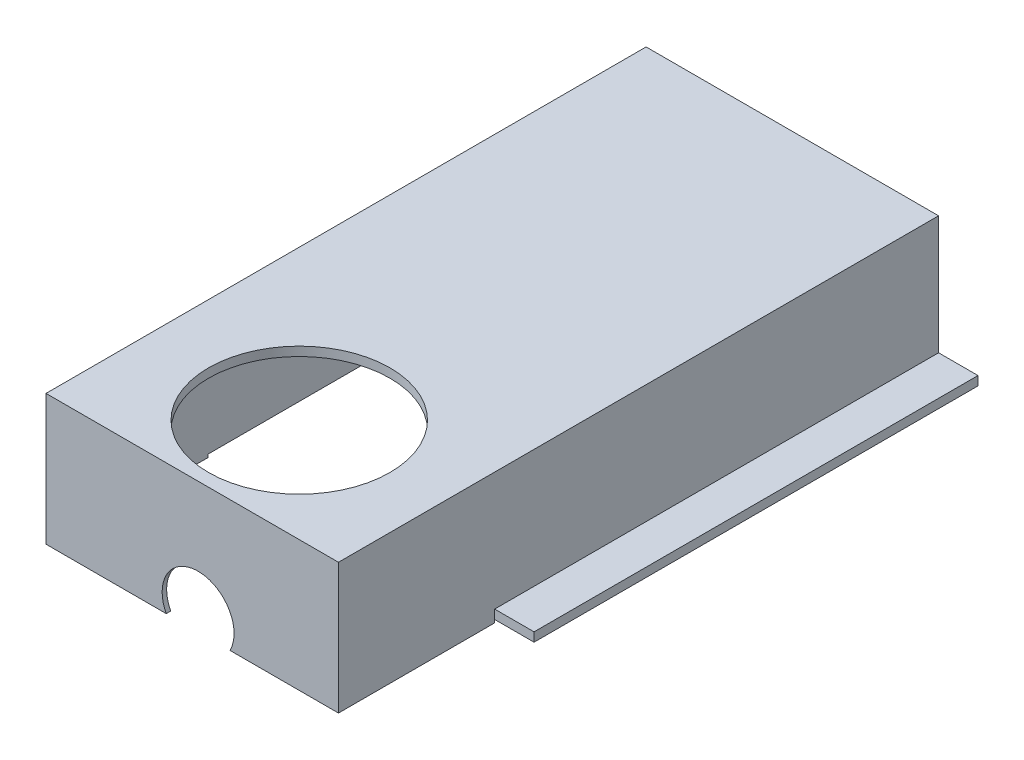
ISO-10303-21;
HEADER;
FILE_DESCRIPTION(('STEP AP214'),'2;1');
FILE_NAME('part.step','',(''),(''),'','','');
FILE_SCHEMA(('AUTOMOTIVE_DESIGN { 1 0 10303 214 1 1 1 1 }'));
ENDSEC;
DATA;
#1=APPLICATION_CONTEXT('core data for automotive mechanical design processes');
#2=APPLICATION_PROTOCOL_DEFINITION('international standard','automotive_design',2000,#1);
#3=PRODUCT_CONTEXT('',#1,'mechanical');
#4=PRODUCT('Part','Part','',(#3));
#5=PRODUCT_RELATED_PRODUCT_CATEGORY('part','',(#4));
#6=PRODUCT_DEFINITION_FORMATION('','',#4);
#7=PRODUCT_DEFINITION_CONTEXT('part definition',#1,'design');
#8=PRODUCT_DEFINITION('design','',#6,#7);
#9=PRODUCT_DEFINITION_SHAPE('','',#8);
#10=(LENGTH_UNIT() NAMED_UNIT(*) SI_UNIT(.MILLI.,.METRE.));
#11=(NAMED_UNIT(*) PLANE_ANGLE_UNIT() SI_UNIT($,.RADIAN.));
#12=(NAMED_UNIT(*) SI_UNIT($,.STERADIAN.) SOLID_ANGLE_UNIT());
#13=UNCERTAINTY_MEASURE_WITH_UNIT(LENGTH_MEASURE(1.E-05),#10,'distance_accuracy_value','');
#14=(GEOMETRIC_REPRESENTATION_CONTEXT(3) GLOBAL_UNCERTAINTY_ASSIGNED_CONTEXT((#13)) GLOBAL_UNIT_ASSIGNED_CONTEXT((#10,
#11,#12)) REPRESENTATION_CONTEXT('',''));
#15=CARTESIAN_POINT('',(0.,0.,0.));
#16=DIRECTION('',(0.,0.,1.));
#17=DIRECTION('',(1.,0.,0.));
#18=AXIS2_PLACEMENT_3D('',#15,#16,#17);
#19=CARTESIAN_POINT('',(97.58,43.58,0.));
#20=DIRECTION('',(-1.,0.,0.));
#21=DIRECTION('',(0.,0.,1.));
#22=AXIS2_PLACEMENT_3D('',#19,#20,#21);
#23=PLANE('',#22);
#24=DIRECTION('',(0.,-1.,0.));
#25=VECTOR('',#24,1.);
#26=CARTESIAN_POINT('',(97.58,1.,-52.1));
#27=LINE('',#26,#25);
#28=CARTESIAN_POINT('',(97.58,4.,-52.1));
#29=VERTEX_POINT('',#28);
#30=CARTESIAN_POINT('',(97.58,1.,-52.1));
#31=VERTEX_POINT('',#30);
#32=EDGE_CURVE('E194',#29,#31,#27,.T.);
#33=ORIENTED_EDGE('',*,*,#32,.F.);
#34=DIRECTION('',(0.,0.,1.));
#35=VECTOR('',#34,1.);
#36=CARTESIAN_POINT('',(97.58,4.,-52.1));
#37=LINE('',#36,#35);
#38=CARTESIAN_POINT('',(97.58,4.,-200.21));
#39=VERTEX_POINT('',#38);
#40=EDGE_CURVE('E49',#39,#29,#37,.T.);
#41=ORIENTED_EDGE('',*,*,#40,.F.);
#42=DIRECTION('',(0.,-1.,0.));
#43=VECTOR('',#42,1.);
#44=CARTESIAN_POINT('',(97.58,43.58,-200.21));
#45=LINE('',#44,#43);
#46=CARTESIAN_POINT('',(97.58,43.58,-200.21));
#47=VERTEX_POINT('',#46);
#48=EDGE_CURVE('E311',#47,#39,#45,.T.);
#49=ORIENTED_EDGE('',*,*,#48,.F.);
#50=DIRECTION('',(0.,0.,-1.));
#51=VECTOR('',#50,1.);
#52=CARTESIAN_POINT('',(97.58,43.58,0.));
#53=LINE('',#52,#51);
#54=CARTESIAN_POINT('',(97.58,43.58,0.));
#55=VERTEX_POINT('',#54);
#56=EDGE_CURVE('E299',#55,#47,#53,.T.);
#57=ORIENTED_EDGE('',*,*,#56,.F.);
#58=DIRECTION('',(0.,-1.,0.));
#59=VECTOR('',#58,1.);
#60=CARTESIAN_POINT('',(97.58,43.58,0.));
#61=LINE('',#60,#59);
#62=CARTESIAN_POINT('',(97.58,0.,0.));
#63=VERTEX_POINT('',#62);
#64=EDGE_CURVE('E313',#55,#63,#61,.T.);
#65=ORIENTED_EDGE('',*,*,#64,.T.);
#66=DIRECTION('',(0.,0.,-1.));
#67=VECTOR('',#66,1.);
#68=CARTESIAN_POINT('',(97.58,0.,0.));
#69=LINE('',#68,#67);
#70=CARTESIAN_POINT('',(97.58,0.,-52.1));
#71=VERTEX_POINT('',#70);
#72=EDGE_CURVE('E297',#63,#71,#69,.T.);
#73=ORIENTED_EDGE('',*,*,#72,.T.);
#74=DIRECTION('',(0.,1.,0.));
#75=VECTOR('',#74,1.);
#76=CARTESIAN_POINT('',(97.58,43.58,-52.1));
#77=LINE('',#76,#75);
#78=EDGE_CURVE('E273',#71,#31,#77,.T.);
#79=ORIENTED_EDGE('',*,*,#78,.T.);
#80=EDGE_LOOP('',(#33,#41,#49,#57,#65,#73,#79));
#81=FACE_BOUND('',#80,.T.);
#82=ADVANCED_FACE('F33',(#81),#23,.F.);
#83=CARTESIAN_POINT('',(0.,43.58,0.));
#84=DIRECTION('',(1.,0.,0.));
#85=DIRECTION('',(0.,0.,-1.));
#86=AXIS2_PLACEMENT_3D('',#83,#84,#85);
#87=PLANE('',#86);
#88=DIRECTION('',(0.,0.,-1.));
#89=VECTOR('',#88,1.);
#90=CARTESIAN_POINT('',(0.,4.,-52.1));
#91=LINE('',#90,#89);
#92=CARTESIAN_POINT('',(0.,4.,-52.1));
#93=VERTEX_POINT('',#92);
#94=CARTESIAN_POINT('',(0.,4.,-200.21));
#95=VERTEX_POINT('',#94);
#96=EDGE_CURVE('E213',#93,#95,#91,.T.);
#97=ORIENTED_EDGE('',*,*,#96,.F.);
#98=DIRECTION('',(0.,1.,0.));
#99=VECTOR('',#98,1.);
#100=CARTESIAN_POINT('',(0.,1.,-52.1));
#101=LINE('',#100,#99);
#102=CARTESIAN_POINT('',(0.,1.,-52.1));
#103=VERTEX_POINT('',#102);
#104=EDGE_CURVE('E208',#103,#93,#101,.T.);
#105=ORIENTED_EDGE('',*,*,#104,.F.);
#106=DIRECTION('',(0.,-1.,0.));
#107=VECTOR('',#106,1.);
#108=CARTESIAN_POINT('',(0.,1.,-52.1));
#109=LINE('',#108,#107);
#110=CARTESIAN_POINT('',(0.,0.,-52.1));
#111=VERTEX_POINT('',#110);
#112=EDGE_CURVE('E287',#103,#111,#109,.T.);
#113=ORIENTED_EDGE('',*,*,#112,.T.);
#114=DIRECTION('',(0.,0.,1.));
#115=VECTOR('',#114,1.);
#116=CARTESIAN_POINT('',(0.,0.,0.));
#117=LINE('',#116,#115);
#118=CARTESIAN_POINT('',(0.,0.,0.));
#119=VERTEX_POINT('',#118);
#120=EDGE_CURVE('E292',#111,#119,#117,.T.);
#121=ORIENTED_EDGE('',*,*,#120,.T.);
#122=DIRECTION('',(0.,-1.,0.));
#123=VECTOR('',#122,1.);
#124=CARTESIAN_POINT('',(0.,43.58,0.));
#125=LINE('',#124,#123);
#126=CARTESIAN_POINT('',(0.,43.58,0.));
#127=VERTEX_POINT('',#126);
#128=EDGE_CURVE('E42',#127,#119,#125,.T.);
#129=ORIENTED_EDGE('',*,*,#128,.F.);
#130=DIRECTION('',(0.,0.,1.));
#131=VECTOR('',#130,1.);
#132=CARTESIAN_POINT('',(0.,43.58,0.));
#133=LINE('',#132,#131);
#134=CARTESIAN_POINT('',(0.,43.58,-200.21));
#135=VERTEX_POINT('',#134);
#136=EDGE_CURVE('E293',#135,#127,#133,.T.);
#137=ORIENTED_EDGE('',*,*,#136,.F.);
#138=DIRECTION('',(0.,-1.,0.));
#139=VECTOR('',#138,1.);
#140=CARTESIAN_POINT('',(0.,43.58,-200.21));
#141=LINE('',#140,#139);
#142=EDGE_CURVE('E57',#135,#95,#141,.T.);
#143=ORIENTED_EDGE('',*,*,#142,.T.);
#144=EDGE_LOOP('',(#97,#105,#113,#121,#129,#137,#143));
#145=FACE_BOUND('',#144,.T.);
#146=ADVANCED_FACE('F35',(#145),#87,.F.);
#147=CARTESIAN_POINT('',(0.,0.,0.));
#148=DIRECTION('',(0.,-1.,0.));
#149=DIRECTION('',(0.,0.,-1.));
#150=AXIS2_PLACEMENT_3D('',#147,#148,#149);
#151=PLANE('',#150);
#152=DIRECTION('',(0.,0.,1.));
#153=VECTOR('',#152,1.);
#154=CARTESIAN_POINT('',(61.3757673129335,0.,-39.58));
#155=LINE('',#154,#153);
#156=CARTESIAN_POINT('',(61.3757673129335,0.,-1.5));
#157=VERTEX_POINT('',#156);
#158=CARTESIAN_POINT('',(61.3757673129335,0.,0.));
#159=VERTEX_POINT('',#158);
#160=EDGE_CURVE('E239',#157,#159,#155,.T.);
#161=ORIENTED_EDGE('',*,*,#160,.F.);
#162=DIRECTION('',(-1.,0.,0.));
#163=VECTOR('',#162,1.);
#164=CARTESIAN_POINT('',(2.,0.,-1.5));
#165=LINE('',#164,#163);
#166=CARTESIAN_POINT('',(95.58,0.,-1.5));
#167=VERTEX_POINT('',#166);
#168=EDGE_CURVE('E256',#167,#157,#165,.T.);
#169=ORIENTED_EDGE('',*,*,#168,.F.);
#170=DIRECTION('',(0.,0.,1.));
#171=VECTOR('',#170,1.);
#172=CARTESIAN_POINT('',(95.58,0.,-1.5));
#173=LINE('',#172,#171);
#174=CARTESIAN_POINT('',(95.58,0.,-52.1));
#175=VERTEX_POINT('',#174);
#176=EDGE_CURVE('E264',#175,#167,#173,.T.);
#177=ORIENTED_EDGE('',*,*,#176,.F.);
#178=DIRECTION('',(-1.,0.,0.));
#179=VECTOR('',#178,1.);
#180=CARTESIAN_POINT('',(0.,0.,-52.1));
#181=LINE('',#180,#179);
#182=EDGE_CURVE('E179',#71,#175,#181,.T.);
#183=ORIENTED_EDGE('',*,*,#182,.F.);
#184=ORIENTED_EDGE('',*,*,#72,.F.);
#185=DIRECTION('',(1.,0.,0.));
#186=VECTOR('',#185,1.);
#187=CARTESIAN_POINT('',(0.,0.,0.));
#188=LINE('',#187,#186);
#189=EDGE_CURVE('E304',#159,#63,#188,.T.);
#190=ORIENTED_EDGE('',*,*,#189,.F.);
#191=EDGE_LOOP('',(#161,#169,#177,#183,#184,#190));
#192=FACE_BOUND('',#191,.T.);
#193=ADVANCED_FACE('F340',(#192),#151,.T.);
#194=CARTESIAN_POINT('',(0.,1.,0.));
#195=DIRECTION('',(0.,1.,0.));
#196=DIRECTION('',(0.,0.,1.));
#197=AXIS2_PLACEMENT_3D('',#194,#195,#196);
#198=PLANE('',#197);
#199=DIRECTION('',(-1.,0.,0.));
#200=VECTOR('',#199,1.);
#201=CARTESIAN_POINT('',(0.,1.,-52.1));
#202=LINE('',#201,#200);
#203=CARTESIAN_POINT('',(95.58,1.,-52.1));
#204=VERTEX_POINT('',#203);
#205=EDGE_CURVE('E285',#31,#204,#202,.T.);
#206=ORIENTED_EDGE('',*,*,#205,.T.);
#207=DIRECTION('',(0.,0.,1.));
#208=VECTOR('',#207,1.);
#209=CARTESIAN_POINT('',(95.58,1.,-200.21));
#210=LINE('',#209,#208);
#211=CARTESIAN_POINT('',(95.58,1.,-200.21));
#212=VERTEX_POINT('',#211);
#213=EDGE_CURVE('E175',#212,#204,#210,.T.);
#214=ORIENTED_EDGE('',*,*,#213,.F.);
#215=DIRECTION('',(1.,0.,0.));
#216=VECTOR('',#215,1.);
#217=CARTESIAN_POINT('',(0.,1.,-200.21));
#218=LINE('',#217,#216);
#219=CARTESIAN_POINT('',(110.73,1.,-200.21));
#220=VERTEX_POINT('',#219);
#221=EDGE_CURVE('E168',#212,#220,#218,.T.);
#222=ORIENTED_EDGE('',*,*,#221,.T.);
#223=DIRECTION('',(0.,0.,-1.));
#224=VECTOR('',#223,1.);
#225=CARTESIAN_POINT('',(110.73,1.,-200.21));
#226=LINE('',#225,#224);
#227=CARTESIAN_POINT('',(110.73,1.,-52.1));
#228=VERTEX_POINT('',#227);
#229=EDGE_CURVE('E174',#228,#220,#226,.T.);
#230=ORIENTED_EDGE('',*,*,#229,.F.);
#231=DIRECTION('',(-1.,0.,0.));
#232=VECTOR('',#231,1.);
#233=CARTESIAN_POINT('',(110.73,1.,-52.1));
#234=LINE('',#233,#232);
#235=EDGE_CURVE('E201',#228,#31,#234,.T.);
#236=ORIENTED_EDGE('',*,*,#235,.T.);
#237=EDGE_LOOP('',(#206,#214,#222,#230,#236));
#238=FACE_BOUND('',#237,.T.);
#239=ADVANCED_FACE('F171',(#238),#198,.F.);
#240=CARTESIAN_POINT('',(0.,1.,-52.1));
#241=DIRECTION('',(0.,0.,1.));
#242=DIRECTION('',(1.,0.,0.));
#243=AXIS2_PLACEMENT_3D('',#240,#241,#242);
#244=PLANE('',#243);
#245=CARTESIAN_POINT('',(2.,1.,-52.1));
#246=VERTEX_POINT('',#245);
#247=EDGE_CURVE('E284',#246,#103,#202,.T.);
#248=ORIENTED_EDGE('',*,*,#247,.F.);
#249=DIRECTION('',(0.,-1.,0.));
#250=VECTOR('',#249,1.);
#251=CARTESIAN_POINT('',(2.,40.58,-52.1));
#252=LINE('',#251,#250);
#253=CARTESIAN_POINT('',(2.,0.,-52.1));
#254=VERTEX_POINT('',#253);
#255=EDGE_CURVE('E262',#246,#254,#252,.T.);
#256=ORIENTED_EDGE('',*,*,#255,.T.);
#257=EDGE_CURVE('E281',#254,#111,#181,.T.);
#258=ORIENTED_EDGE('',*,*,#257,.T.);
#259=ORIENTED_EDGE('',*,*,#112,.F.);
#260=EDGE_LOOP('',(#248,#256,#258,#259));
#261=FACE_BOUND('',#260,.T.);
#262=ADVANCED_FACE('F372',(#261),#244,.F.);
#263=CARTESIAN_POINT('',(0.,43.58,0.));
#264=DIRECTION('',(0.,0.,-1.));
#265=DIRECTION('',(-1.,0.,0.));
#266=AXIS2_PLACEMENT_3D('',#263,#264,#265);
#267=PLANE('',#266);
#268=CARTESIAN_POINT('',(40.1178182114798,0.,0.));
#269=VERTEX_POINT('',#268);
#270=EDGE_CURVE('E305',#119,#269,#188,.T.);
#271=ORIENTED_EDGE('',*,*,#270,.T.);
#272=CARTESIAN_POINT('',(50.7467927622066,5.56999999999999,0.));
#273=DIRECTION('',(0.,0.,1.));
#274=DIRECTION('',(1.,0.,0.));
#275=AXIS2_PLACEMENT_3D('',#272,#273,#274);
#276=CIRCLE('',#275,12.);
#277=EDGE_CURVE('E235',#159,#269,#276,.T.);
#278=ORIENTED_EDGE('',*,*,#277,.F.);
#279=ORIENTED_EDGE('',*,*,#189,.T.);
#280=ORIENTED_EDGE('',*,*,#64,.F.);
#281=DIRECTION('',(1.,0.,0.));
#282=VECTOR('',#281,1.);
#283=CARTESIAN_POINT('',(0.,43.58,0.));
#284=LINE('',#283,#282);
#285=EDGE_CURVE('E296',#127,#55,#284,.T.);
#286=ORIENTED_EDGE('',*,*,#285,.F.);
#287=ORIENTED_EDGE('',*,*,#128,.T.);
#288=EDGE_LOOP('',(#271,#278,#279,#280,#286,#287));
#289=FACE_BOUND('',#288,.T.);
#290=ADVANCED_FACE('F319',(#289),#267,.F.);
#291=CARTESIAN_POINT('',(0.,43.58,-200.21));
#292=DIRECTION('',(0.,0.,1.));
#293=DIRECTION('',(1.,0.,0.));
#294=AXIS2_PLACEMENT_3D('',#291,#292,#293);
#295=PLANE('',#294);
#296=ORIENTED_EDGE('',*,*,#221,.F.);
#297=DIRECTION('',(0.,-1.,0.));
#298=VECTOR('',#297,1.);
#299=CARTESIAN_POINT('',(95.58,40.58,-200.21));
#300=LINE('',#299,#298);
#301=CARTESIAN_POINT('',(95.58,40.58,-200.21));
#302=VERTEX_POINT('',#301);
#303=EDGE_CURVE('E248',#302,#212,#300,.T.);
#304=ORIENTED_EDGE('',*,*,#303,.F.);
#305=DIRECTION('',(1.,0.,0.));
#306=VECTOR('',#305,1.);
#307=CARTESIAN_POINT('',(95.58,40.58,-200.21));
#308=LINE('',#307,#306);
#309=CARTESIAN_POINT('',(2.,40.58,-200.21));
#310=VERTEX_POINT('',#309);
#311=EDGE_CURVE('E241',#310,#302,#308,.T.);
#312=ORIENTED_EDGE('',*,*,#311,.F.);
#313=DIRECTION('',(0.,-1.,0.));
#314=VECTOR('',#313,1.);
#315=CARTESIAN_POINT('',(2.,40.58,-200.21));
#316=LINE('',#315,#314);
#317=CARTESIAN_POINT('',(2.,1.,-200.21));
#318=VERTEX_POINT('',#317);
#319=EDGE_CURVE('E244',#310,#318,#316,.T.);
#320=ORIENTED_EDGE('',*,*,#319,.T.);
#321=CARTESIAN_POINT('',(-13.15,1.,-200.21));
#322=VERTEX_POINT('',#321);
#323=EDGE_CURVE('E178',#322,#318,#218,.T.);
#324=ORIENTED_EDGE('',*,*,#323,.F.);
#325=DIRECTION('',(0.,-1.,0.));
#326=VECTOR('',#325,1.);
#327=CARTESIAN_POINT('',(-13.15,1.,-200.21));
#328=LINE('',#327,#326);
#329=CARTESIAN_POINT('',(-13.15,4.,-200.21));
#330=VERTEX_POINT('',#329);
#331=EDGE_CURVE('E217',#330,#322,#328,.T.);
#332=ORIENTED_EDGE('',*,*,#331,.F.);
#333=DIRECTION('',(1.,0.,0.));
#334=VECTOR('',#333,1.);
#335=CARTESIAN_POINT('',(-13.15,4.,-200.21));
#336=LINE('',#335,#334);
#337=EDGE_CURVE('E220',#330,#95,#336,.T.);
#338=ORIENTED_EDGE('',*,*,#337,.T.);
#339=ORIENTED_EDGE('',*,*,#142,.F.);
#340=DIRECTION('',(-1.,0.,0.));
#341=VECTOR('',#340,1.);
#342=CARTESIAN_POINT('',(0.,43.58,-200.21));
#343=LINE('',#342,#341);
#344=EDGE_CURVE('E301',#47,#135,#343,.T.);
#345=ORIENTED_EDGE('',*,*,#344,.F.);
#346=ORIENTED_EDGE('',*,*,#48,.T.);
#347=DIRECTION('',(-1.,0.,0.));
#348=VECTOR('',#347,1.);
#349=CARTESIAN_POINT('',(110.73,4.,-200.21));
#350=LINE('',#349,#348);
#351=CARTESIAN_POINT('',(110.73,4.,-200.21));
#352=VERTEX_POINT('',#351);
#353=EDGE_CURVE('E185',#352,#39,#350,.T.);
#354=ORIENTED_EDGE('',*,*,#353,.F.);
#355=DIRECTION('',(0.,1.,0.));
#356=VECTOR('',#355,1.);
#357=CARTESIAN_POINT('',(110.73,1.,-200.21));
#358=LINE('',#357,#356);
#359=EDGE_CURVE('E182',#220,#352,#358,.T.);
#360=ORIENTED_EDGE('',*,*,#359,.F.);
#361=EDGE_LOOP('',(#296,#304,#312,#320,#324,#332,#338,#339,#345,#346,#354,#360));
#362=FACE_BOUND('',#361,.T.);
#363=ADVANCED_FACE('F183',(#362),#295,.F.);
#364=CARTESIAN_POINT('',(0.,43.58,0.));
#365=DIRECTION('',(0.,-1.,0.));
#366=DIRECTION('',(0.,0.,-1.));
#367=AXIS2_PLACEMENT_3D('',#364,#365,#366);
#368=PLANE('',#367);
#369=CARTESIAN_POINT('',(49.98,43.58,-34.51));
#370=DIRECTION('',(0.,1.,0.));
#371=DIRECTION('',(0.,0.,1.));
#372=AXIS2_PLACEMENT_3D('',#369,#370,#371);
#373=CIRCLE('',#372,30.26);
#374=CARTESIAN_POINT('',(49.98,43.58,-4.24999999999999));
#375=VERTEX_POINT('',#374);
#376=EDGE_CURVE('E232',#375,#375,#373,.T.);
#377=ORIENTED_EDGE('',*,*,#376,.F.);
#378=EDGE_LOOP('',(#377));
#379=FACE_BOUND('',#378,.T.);
#380=ORIENTED_EDGE('',*,*,#136,.T.);
#381=ORIENTED_EDGE('',*,*,#285,.T.);
#382=ORIENTED_EDGE('',*,*,#56,.T.);
#383=ORIENTED_EDGE('',*,*,#344,.T.);
#384=EDGE_LOOP('',(#380,#381,#382,#383));
#385=FACE_BOUND('',#384,.T.);
#386=ADVANCED_FACE('F377',(#379,#385),#368,.F.);
#387=DIRECTION('',(0.,0.,1.));
#388=VECTOR('',#387,1.);
#389=CARTESIAN_POINT('',(40.1178182114798,0.,-39.58));
#390=LINE('',#389,#388);
#391=CARTESIAN_POINT('',(40.1178182114798,0.,-1.5));
#392=VERTEX_POINT('',#391);
#393=EDGE_CURVE('E237',#269,#392,#390,.F.);
#394=ORIENTED_EDGE('',*,*,#393,.F.);
#395=ORIENTED_EDGE('',*,*,#270,.F.);
#396=ORIENTED_EDGE('',*,*,#120,.F.);
#397=ORIENTED_EDGE('',*,*,#257,.F.);
#398=DIRECTION('',(0.,0.,-1.));
#399=VECTOR('',#398,1.);
#400=CARTESIAN_POINT('',(2.,0.,-1.5));
#401=LINE('',#400,#399);
#402=CARTESIAN_POINT('',(2.,0.,-1.5));
#403=VERTEX_POINT('',#402);
#404=EDGE_CURVE('E250',#403,#254,#401,.T.);
#405=ORIENTED_EDGE('',*,*,#404,.F.);
#406=EDGE_CURVE('E267',#392,#403,#165,.T.);
#407=ORIENTED_EDGE('',*,*,#406,.F.);
#408=EDGE_LOOP('',(#394,#395,#396,#397,#405,#407));
#409=FACE_BOUND('',#408,.T.);
#410=ADVANCED_FACE('F328',(#409),#151,.T.);
#411=ORIENTED_EDGE('',*,*,#182,.T.);
#412=DIRECTION('',(0.,-1.,0.));
#413=VECTOR('',#412,1.);
#414=CARTESIAN_POINT('',(95.58,40.58,-52.1));
#415=LINE('',#414,#413);
#416=EDGE_CURVE('E276',#204,#175,#415,.T.);
#417=ORIENTED_EDGE('',*,*,#416,.F.);
#418=ORIENTED_EDGE('',*,*,#205,.F.);
#419=ORIENTED_EDGE('',*,*,#78,.F.);
#420=EDGE_LOOP('',(#411,#417,#418,#419));
#421=FACE_BOUND('',#420,.T.);
#422=ADVANCED_FACE('F347',(#421),#244,.F.);
#423=ORIENTED_EDGE('',*,*,#323,.T.);
#424=DIRECTION('',(0.,0.,-1.));
#425=VECTOR('',#424,1.);
#426=CARTESIAN_POINT('',(2.,1.,-200.21));
#427=LINE('',#426,#425);
#428=EDGE_CURVE('E245',#246,#318,#427,.T.);
#429=ORIENTED_EDGE('',*,*,#428,.F.);
#430=ORIENTED_EDGE('',*,*,#247,.T.);
#431=DIRECTION('',(1.,0.,0.));
#432=VECTOR('',#431,1.);
#433=CARTESIAN_POINT('',(-13.15,1.,-52.1));
#434=LINE('',#433,#432);
#435=CARTESIAN_POINT('',(-13.15,1.,-52.1));
#436=VERTEX_POINT('',#435);
#437=EDGE_CURVE('E229',#436,#103,#434,.T.);
#438=ORIENTED_EDGE('',*,*,#437,.F.);
#439=DIRECTION('',(0.,0.,1.));
#440=VECTOR('',#439,1.);
#441=CARTESIAN_POINT('',(-13.15,1.,-200.21));
#442=LINE('',#441,#440);
#443=EDGE_CURVE('E209',#322,#436,#442,.T.);
#444=ORIENTED_EDGE('',*,*,#443,.F.);
#445=EDGE_LOOP('',(#423,#429,#430,#438,#444));
#446=FACE_BOUND('',#445,.T.);
#447=ADVANCED_FACE('F384',(#446),#198,.F.);
#448=CARTESIAN_POINT('',(2.,40.58,-1.5));
#449=DIRECTION('',(-1.,0.,0.));
#450=DIRECTION('',(0.,0.,1.));
#451=AXIS2_PLACEMENT_3D('',#448,#449,#450);
#452=PLANE('',#451);
#453=ORIENTED_EDGE('',*,*,#404,.T.);
#454=ORIENTED_EDGE('',*,*,#255,.F.);
#455=ORIENTED_EDGE('',*,*,#428,.T.);
#456=ORIENTED_EDGE('',*,*,#319,.F.);
#457=DIRECTION('',(0.,0.,-1.));
#458=VECTOR('',#457,1.);
#459=CARTESIAN_POINT('',(2.,40.58,-1.5));
#460=LINE('',#459,#458);
#461=CARTESIAN_POINT('',(2.,40.58,-1.5));
#462=VERTEX_POINT('',#461);
#463=EDGE_CURVE('E253',#462,#310,#460,.T.);
#464=ORIENTED_EDGE('',*,*,#463,.F.);
#465=DIRECTION('',(0.,-1.,0.));
#466=VECTOR('',#465,1.);
#467=CARTESIAN_POINT('',(2.,40.58,-1.5));
#468=LINE('',#467,#466);
#469=EDGE_CURVE('E270',#462,#403,#468,.T.);
#470=ORIENTED_EDGE('',*,*,#469,.T.);
#471=EDGE_LOOP('',(#453,#454,#455,#456,#464,#470));
#472=FACE_BOUND('',#471,.T.);
#473=ADVANCED_FACE('F392',(#472),#452,.F.);
#474=CARTESIAN_POINT('',(2.,40.58,-1.5));
#475=DIRECTION('',(0.,0.,1.));
#476=DIRECTION('',(1.,0.,0.));
#477=AXIS2_PLACEMENT_3D('',#474,#475,#476);
#478=PLANE('',#477);
#479=ORIENTED_EDGE('',*,*,#168,.T.);
#480=CARTESIAN_POINT('',(50.7467927622066,5.56999999999999,-1.5));
#481=DIRECTION('',(0.,0.,1.));
#482=DIRECTION('',(1.,0.,0.));
#483=AXIS2_PLACEMENT_3D('',#480,#481,#482);
#484=CIRCLE('',#483,12.);
#485=EDGE_CURVE('E11',#157,#392,#484,.T.);
#486=ORIENTED_EDGE('',*,*,#485,.T.);
#487=ORIENTED_EDGE('',*,*,#406,.T.);
#488=ORIENTED_EDGE('',*,*,#469,.F.);
#489=DIRECTION('',(-1.,0.,0.));
#490=VECTOR('',#489,1.);
#491=CARTESIAN_POINT('',(2.,40.58,-1.5));
#492=LINE('',#491,#490);
#493=CARTESIAN_POINT('',(95.58,40.58,-1.5));
#494=VERTEX_POINT('',#493);
#495=EDGE_CURVE('E259',#494,#462,#492,.T.);
#496=ORIENTED_EDGE('',*,*,#495,.F.);
#497=DIRECTION('',(0.,-1.,0.));
#498=VECTOR('',#497,1.);
#499=CARTESIAN_POINT('',(95.58,40.58,-1.5));
#500=LINE('',#499,#498);
#501=EDGE_CURVE('E274',#494,#167,#500,.T.);
#502=ORIENTED_EDGE('',*,*,#501,.T.);
#503=EDGE_LOOP('',(#479,#486,#487,#488,#496,#502));
#504=FACE_BOUND('',#503,.T.);
#505=ADVANCED_FACE('F335',(#504),#478,.F.);
#506=CARTESIAN_POINT('',(95.58,40.58,-1.5));
#507=DIRECTION('',(1.,0.,0.));
#508=DIRECTION('',(0.,0.,-1.));
#509=AXIS2_PLACEMENT_3D('',#506,#507,#508);
#510=PLANE('',#509);
#511=ORIENTED_EDGE('',*,*,#176,.T.);
#512=ORIENTED_EDGE('',*,*,#501,.F.);
#513=DIRECTION('',(0.,0.,1.));
#514=VECTOR('',#513,1.);
#515=CARTESIAN_POINT('',(95.58,40.58,-1.5));
#516=LINE('',#515,#514);
#517=EDGE_CURVE('E255',#302,#494,#516,.T.);
#518=ORIENTED_EDGE('',*,*,#517,.F.);
#519=ORIENTED_EDGE('',*,*,#303,.T.);
#520=ORIENTED_EDGE('',*,*,#213,.T.);
#521=ORIENTED_EDGE('',*,*,#416,.T.);
#522=EDGE_LOOP('',(#511,#512,#518,#519,#520,#521));
#523=FACE_BOUND('',#522,.T.);
#524=ADVANCED_FACE('F484',(#523),#510,.F.);
#525=CARTESIAN_POINT('',(0.,40.58,0.));
#526=DIRECTION('',(0.,-1.,0.));
#527=DIRECTION('',(0.,0.,-1.));
#528=AXIS2_PLACEMENT_3D('',#525,#526,#527);
#529=PLANE('',#528);
#530=CARTESIAN_POINT('',(49.98,40.58,-34.51));
#531=DIRECTION('',(0.,-1.,0.));
#532=DIRECTION('',(0.,0.,-1.));
#533=AXIS2_PLACEMENT_3D('',#530,#531,#532);
#534=CIRCLE('',#533,30.26);
#535=CARTESIAN_POINT('',(49.98,40.58,-64.77));
#536=VERTEX_POINT('',#535);
#537=EDGE_CURVE('E37',#536,#536,#534,.T.);
#538=ORIENTED_EDGE('',*,*,#537,.F.);
#539=EDGE_LOOP('',(#538));
#540=FACE_BOUND('',#539,.T.);
#541=ORIENTED_EDGE('',*,*,#463,.T.);
#542=ORIENTED_EDGE('',*,*,#311,.T.);
#543=ORIENTED_EDGE('',*,*,#517,.T.);
#544=ORIENTED_EDGE('',*,*,#495,.T.);
#545=EDGE_LOOP('',(#541,#542,#543,#544));
#546=FACE_BOUND('',#545,.T.);
#547=ADVANCED_FACE('F492',(#540,#546),#529,.T.);
#548=CARTESIAN_POINT('',(50.7467927622066,5.56999999999999,-39.58));
#549=DIRECTION('',(0.,0.,1.));
#550=DIRECTION('',(1.,0.,0.));
#551=AXIS2_PLACEMENT_3D('',#548,#549,#550);
#552=CYLINDRICAL_SURFACE('',#551,12.);
#553=ORIENTED_EDGE('',*,*,#160,.T.);
#554=ORIENTED_EDGE('',*,*,#277,.T.);
#555=ORIENTED_EDGE('',*,*,#393,.T.);
#556=ORIENTED_EDGE('',*,*,#485,.F.);
#557=EDGE_LOOP('',(#553,#554,#555,#556));
#558=FACE_BOUND('',#557,.T.);
#559=ADVANCED_FACE('F332',(#558),#552,.F.);
#560=CARTESIAN_POINT('',(49.98,4.,-34.51));
#561=DIRECTION('',(0.,1.,0.));
#562=DIRECTION('',(0.,0.,1.));
#563=AXIS2_PLACEMENT_3D('',#560,#561,#562);
#564=CYLINDRICAL_SURFACE('',#563,30.26);
#565=ORIENTED_EDGE('',*,*,#537,.T.);
#566=EDGE_LOOP('',(#565));
#567=FACE_BOUND('',#566,.T.);
#568=ORIENTED_EDGE('',*,*,#376,.T.);
#569=EDGE_LOOP('',(#568));
#570=FACE_BOUND('',#569,.T.);
#571=ADVANCED_FACE('F521',(#567,#570),#564,.F.);
#572=CARTESIAN_POINT('',(-13.15,1.,-52.1));
#573=DIRECTION('',(0.,0.,-1.));
#574=DIRECTION('',(-1.,0.,0.));
#575=AXIS2_PLACEMENT_3D('',#572,#573,#574);
#576=PLANE('',#575);
#577=ORIENTED_EDGE('',*,*,#104,.T.);
#578=DIRECTION('',(1.,0.,0.));
#579=VECTOR('',#578,1.);
#580=CARTESIAN_POINT('',(-13.15,4.,-52.1));
#581=LINE('',#580,#579);
#582=CARTESIAN_POINT('',(-13.15,4.,-52.1));
#583=VERTEX_POINT('',#582);
#584=EDGE_CURVE('E226',#583,#93,#581,.T.);
#585=ORIENTED_EDGE('',*,*,#584,.F.);
#586=DIRECTION('',(0.,1.,0.));
#587=VECTOR('',#586,1.);
#588=CARTESIAN_POINT('',(-13.15,1.,-52.1));
#589=LINE('',#588,#587);
#590=EDGE_CURVE('E212',#436,#583,#589,.T.);
#591=ORIENTED_EDGE('',*,*,#590,.F.);
#592=ORIENTED_EDGE('',*,*,#437,.T.);
#593=EDGE_LOOP('',(#577,#585,#591,#592));
#594=FACE_BOUND('',#593,.T.);
#595=ADVANCED_FACE('F528',(#594),#576,.F.);
#596=CARTESIAN_POINT('',(-13.15,4.,-52.1));
#597=DIRECTION('',(0.,-1.,0.));
#598=DIRECTION('',(0.,0.,-1.));
#599=AXIS2_PLACEMENT_3D('',#596,#597,#598);
#600=PLANE('',#599);
#601=ORIENTED_EDGE('',*,*,#96,.T.);
#602=ORIENTED_EDGE('',*,*,#337,.F.);
#603=DIRECTION('',(0.,0.,-1.));
#604=VECTOR('',#603,1.);
#605=CARTESIAN_POINT('',(-13.15,4.,-52.1));
#606=LINE('',#605,#604);
#607=EDGE_CURVE('E215',#583,#330,#606,.T.);
#608=ORIENTED_EDGE('',*,*,#607,.F.);
#609=ORIENTED_EDGE('',*,*,#584,.T.);
#610=EDGE_LOOP('',(#601,#602,#608,#609));
#611=FACE_BOUND('',#610,.T.);
#612=ADVANCED_FACE('F361',(#611),#600,.F.);
#613=CARTESIAN_POINT('',(-13.15,0.,0.));
#614=DIRECTION('',(-1.,0.,0.));
#615=DIRECTION('',(0.,0.,1.));
#616=AXIS2_PLACEMENT_3D('',#613,#614,#615);
#617=PLANE('',#616);
#618=ORIENTED_EDGE('',*,*,#443,.T.);
#619=ORIENTED_EDGE('',*,*,#590,.T.);
#620=ORIENTED_EDGE('',*,*,#607,.T.);
#621=ORIENTED_EDGE('',*,*,#331,.T.);
#622=EDGE_LOOP('',(#618,#619,#620,#621));
#623=FACE_BOUND('',#622,.T.);
#624=ADVANCED_FACE('F354',(#623),#617,.T.);
#625=CARTESIAN_POINT('',(110.73,4.,-52.1));
#626=DIRECTION('',(0.,-1.,0.));
#627=DIRECTION('',(0.,0.,-1.));
#628=AXIS2_PLACEMENT_3D('',#625,#626,#627);
#629=PLANE('',#628);
#630=ORIENTED_EDGE('',*,*,#40,.T.);
#631=DIRECTION('',(-1.,0.,0.));
#632=VECTOR('',#631,1.);
#633=CARTESIAN_POINT('',(110.73,4.,-52.1));
#634=LINE('',#633,#632);
#635=CARTESIAN_POINT('',(110.73,4.,-52.1));
#636=VERTEX_POINT('',#635);
#637=EDGE_CURVE('E204',#636,#29,#634,.T.);
#638=ORIENTED_EDGE('',*,*,#637,.F.);
#639=DIRECTION('',(0.,0.,1.));
#640=VECTOR('',#639,1.);
#641=CARTESIAN_POINT('',(110.73,4.,-52.1));
#642=LINE('',#641,#640);
#643=EDGE_CURVE('E188',#352,#636,#642,.T.);
#644=ORIENTED_EDGE('',*,*,#643,.F.);
#645=ORIENTED_EDGE('',*,*,#353,.T.);
#646=EDGE_LOOP('',(#630,#638,#644,#645));
#647=FACE_BOUND('',#646,.T.);
#648=ADVANCED_FACE('F352',(#647),#629,.F.);
#649=CARTESIAN_POINT('',(110.73,1.,-52.1));
#650=DIRECTION('',(0.,0.,-1.));
#651=DIRECTION('',(-1.,0.,0.));
#652=AXIS2_PLACEMENT_3D('',#649,#650,#651);
#653=PLANE('',#652);
#654=ORIENTED_EDGE('',*,*,#32,.T.);
#655=ORIENTED_EDGE('',*,*,#235,.F.);
#656=DIRECTION('',(0.,-1.,0.));
#657=VECTOR('',#656,1.);
#658=CARTESIAN_POINT('',(110.73,1.,-52.1));
#659=LINE('',#658,#657);
#660=EDGE_CURVE('E192',#636,#228,#659,.T.);
#661=ORIENTED_EDGE('',*,*,#660,.F.);
#662=ORIENTED_EDGE('',*,*,#637,.T.);
#663=EDGE_LOOP('',(#654,#655,#661,#662));
#664=FACE_BOUND('',#663,.T.);
#665=ADVANCED_FACE('F349',(#664),#653,.F.);
#666=CARTESIAN_POINT('',(110.73,0.,0.));
#667=DIRECTION('',(-1.,0.,0.));
#668=DIRECTION('',(0.,0.,1.));
#669=AXIS2_PLACEMENT_3D('',#666,#667,#668);
#670=PLANE('',#669);
#671=ORIENTED_EDGE('',*,*,#229,.T.);
#672=ORIENTED_EDGE('',*,*,#359,.T.);
#673=ORIENTED_EDGE('',*,*,#643,.T.);
#674=ORIENTED_EDGE('',*,*,#660,.T.);
#675=EDGE_LOOP('',(#671,#672,#673,#674));
#676=FACE_BOUND('',#675,.T.);
#677=ADVANCED_FACE('F190',(#676),#670,.F.);
#678=CLOSED_SHELL('',(#82,#146,#193,#239,#262,#290,#363,#386,#410,#422,#447,#473,#505,#524,#547,
#559,#571,#595,#612,#624,#648,#665,#677));
#679=MANIFOLD_SOLID_BREP('B2',#678);
#680=ADVANCED_BREP_SHAPE_REPRESENTATION('',(#18,#679),#14);
#681=SHAPE_DEFINITION_REPRESENTATION(#9,#680);
ENDSEC;
END-ISO-10303-21;
